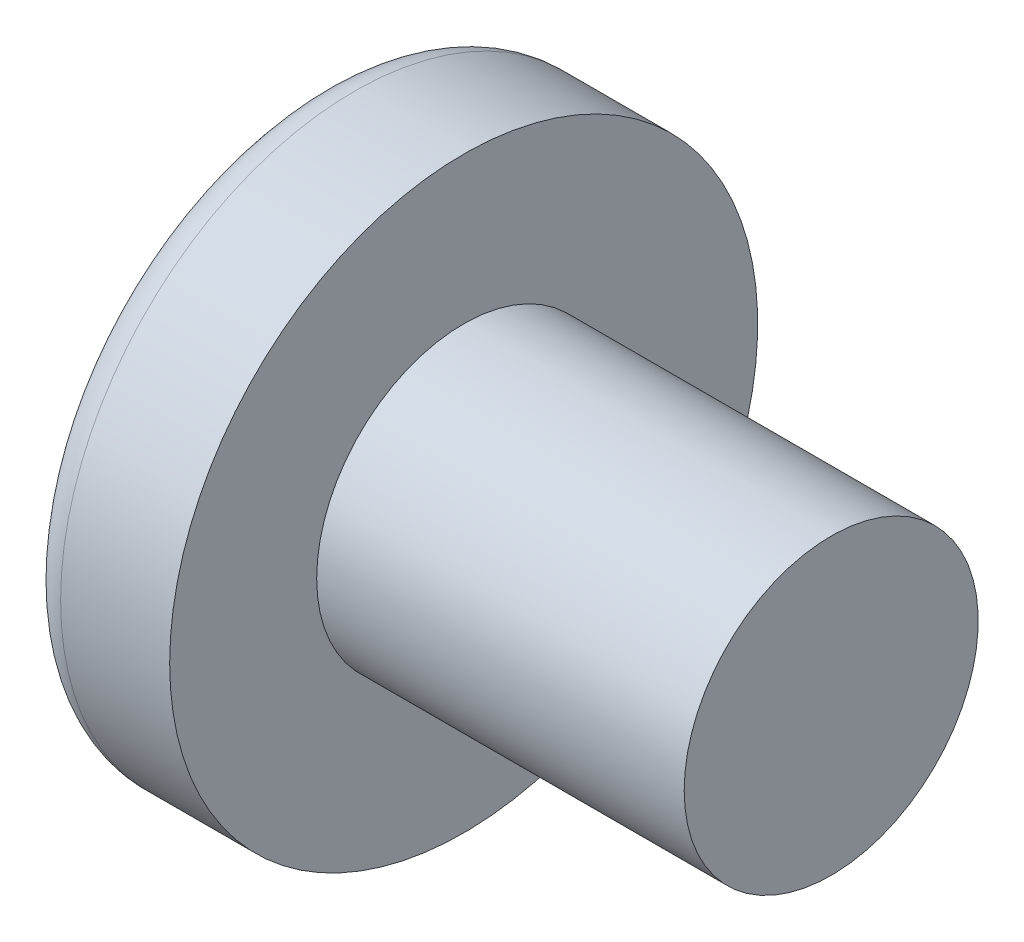
ISO-10303-21;
HEADER;
FILE_DESCRIPTION(('STEP AP214'),'2;1');
FILE_NAME('part.step','',(''),(''),'','','');
FILE_SCHEMA(('AUTOMOTIVE_DESIGN { 1 0 10303 214 1 1 1 1 }'));
ENDSEC;
DATA;
#1=APPLICATION_CONTEXT('core data for automotive mechanical design processes');
#2=APPLICATION_PROTOCOL_DEFINITION('international standard','automotive_design',2000,#1);
#3=PRODUCT_CONTEXT('',#1,'mechanical');
#4=PRODUCT('Part','Part','',(#3));
#5=PRODUCT_RELATED_PRODUCT_CATEGORY('part','',(#4));
#6=PRODUCT_DEFINITION_FORMATION('','',#4);
#7=PRODUCT_DEFINITION_CONTEXT('part definition',#1,'design');
#8=PRODUCT_DEFINITION('design','',#6,#7);
#9=PRODUCT_DEFINITION_SHAPE('','',#8);
#10=(LENGTH_UNIT() NAMED_UNIT(*) SI_UNIT(.MILLI.,.METRE.));
#11=(NAMED_UNIT(*) PLANE_ANGLE_UNIT() SI_UNIT($,.RADIAN.));
#12=(NAMED_UNIT(*) SI_UNIT($,.STERADIAN.) SOLID_ANGLE_UNIT());
#13=UNCERTAINTY_MEASURE_WITH_UNIT(LENGTH_MEASURE(1.E-05),#10,'distance_accuracy_value','');
#14=(GEOMETRIC_REPRESENTATION_CONTEXT(3) GLOBAL_UNCERTAINTY_ASSIGNED_CONTEXT((#13)) GLOBAL_UNIT_ASSIGNED_CONTEXT((#10,
#11,#12)) REPRESENTATION_CONTEXT('',''));
#15=CARTESIAN_POINT('',(0.,0.,0.));
#16=DIRECTION('',(0.,0.,1.));
#17=DIRECTION('',(1.,0.,0.));
#18=AXIS2_PLACEMENT_3D('',#15,#16,#17);
#19=CARTESIAN_POINT('',(6.5,0.,0.));
#20=DIRECTION('',(-1.,0.,0.));
#21=DIRECTION('',(0.,1.,0.));
#22=AXIS2_PLACEMENT_3D('',#19,#20,#21);
#23=SPHERICAL_SURFACE('',#22,6.5);
#24=CARTESIAN_POINT('',(1.22696010591455,0.,0.));
#25=DIRECTION('',(-1.,0.,0.));
#26=DIRECTION('',(0.,0.,1.));
#27=AXIS2_PLACEMENT_3D('',#24,#25,#26);
#28=CIRCLE('',#27,3.80066445182724);
#29=CARTESIAN_POINT('',(1.22696010591455,0.,3.80066445182724));
#30=VERTEX_POINT('',#29);
#31=EDGE_CURVE('E136',#30,#30,#28,.T.);
#32=ORIENTED_EDGE('',*,*,#31,.T.);
#33=EDGE_LOOP('',(#32));
#34=FACE_BOUND('',#33,.T.);
#35=CARTESIAN_POINT('',(6.48571960757402,-0.15048155459631,0.));
#36=DIRECTION('',(-0.0944735162161081,-0.995527375180494,0.));
#37=DIRECTION('',(0.995527375180494,-0.0944735162161081,0.));
#38=AXIS2_PLACEMENT_3D('',#35,#36,#37);
#39=CIRCLE('',#38,6.49824217555167);
#40=CARTESIAN_POINT('',(0.314004666074212,0.4352015980154,1.94783502836694));
#41=VERTEX_POINT('',#40);
#42=CARTESIAN_POINT('',(0.0329034112486444,0.461877533422321,0.461877533422322));
#43=VERTEX_POINT('',#42);
#44=EDGE_CURVE('E167',#41,#43,#39,.T.);
#45=ORIENTED_EDGE('',*,*,#44,.F.);
#46=CARTESIAN_POINT('',(5.02565375064329,0.,-1.83590765485334));
#47=DIRECTION('',(0.626149356629992,0.,0.779703137861998));
#48=DIRECTION('',(0.779703137861998,0.,-0.626149356629992));
#49=AXIS2_PLACEMENT_3D('',#46,#47,#48);
#50=CIRCLE('',#49,6.05852673674539);
#51=CARTESIAN_POINT('',(0.314004666074212,-0.435201598015413,1.94783502836693));
#52=VERTEX_POINT('',#51);
#53=EDGE_CURVE('E132',#41,#52,#50,.T.);
#54=ORIENTED_EDGE('',*,*,#53,.T.);
#55=CARTESIAN_POINT('',(6.48571960757402,0.15048155459631,0.));
#56=DIRECTION('',(-0.094473516216108,0.995527375180494,0.));
#57=DIRECTION('',(-0.995527375180494,-0.094473516216108,0.));
#58=AXIS2_PLACEMENT_3D('',#55,#56,#57);
#59=CIRCLE('',#58,6.49824217555167);
#60=CARTESIAN_POINT('',(0.0329034112486444,-0.461877533422324,0.461877533422322));
#61=VERTEX_POINT('',#60);
#62=EDGE_CURVE('E88',#61,#52,#59,.T.);
#63=ORIENTED_EDGE('',*,*,#62,.F.);
#64=CARTESIAN_POINT('',(6.48571960757402,0.,-0.15048155459631));
#65=DIRECTION('',(-0.094473516216108,0.,-0.995527375180494));
#66=DIRECTION('',(-0.995527375180494,0.,0.094473516216108));
#67=AXIS2_PLACEMENT_3D('',#64,#65,#66);
#68=CIRCLE('',#67,6.49824217555167);
#69=CARTESIAN_POINT('',(0.314004666074212,-1.94783502836693,0.435201598015406));
#70=VERTEX_POINT('',#69);
#71=EDGE_CURVE('E113',#70,#61,#68,.T.);
#72=ORIENTED_EDGE('',*,*,#71,.F.);
#73=CARTESIAN_POINT('',(5.02565375064329,1.83590765485334,0.));
#74=DIRECTION('',(0.626149356629992,-0.779703137861998,0.));
#75=DIRECTION('',(0.779703137861998,0.626149356629992,0.));
#76=AXIS2_PLACEMENT_3D('',#73,#74,#75);
#77=CIRCLE('',#76,6.05852673674539);
#78=CARTESIAN_POINT('',(0.314004666074212,-1.94783502836693,-0.435201598015406));
#79=VERTEX_POINT('',#78);
#80=EDGE_CURVE('E121',#70,#79,#77,.T.);
#81=ORIENTED_EDGE('',*,*,#80,.T.);
#82=CARTESIAN_POINT('',(6.48571960757402,0.,0.15048155459631));
#83=DIRECTION('',(-0.0944735162161081,0.,0.995527375180494));
#84=DIRECTION('',(0.995527375180494,0.,0.0944735162161081));
#85=AXIS2_PLACEMENT_3D('',#82,#83,#84);
#86=CIRCLE('',#85,6.49824217555167);
#87=CARTESIAN_POINT('',(0.0329034112486444,-0.461877533422321,-0.461877533422323));
#88=VERTEX_POINT('',#87);
#89=EDGE_CURVE('E31',#88,#79,#86,.T.);
#90=ORIENTED_EDGE('',*,*,#89,.F.);
#91=CARTESIAN_POINT('',(0.314004666074212,-0.435201598015399,-1.94783502836693));
#92=VERTEX_POINT('',#91);
#93=EDGE_CURVE('E174',#92,#88,#59,.T.);
#94=ORIENTED_EDGE('',*,*,#93,.F.);
#95=CARTESIAN_POINT('',(5.02565375064329,0.,1.83590765485334));
#96=DIRECTION('',(0.626149356629992,0.,-0.779703137861998));
#97=DIRECTION('',(-0.779703137861998,0.,-0.626149356629992));
#98=AXIS2_PLACEMENT_3D('',#95,#96,#97);
#99=CIRCLE('',#98,6.05852673674539);
#100=CARTESIAN_POINT('',(0.314004666074212,0.435201598015413,-1.94783502836693));
#101=VERTEX_POINT('',#100);
#102=EDGE_CURVE('E114',#92,#101,#99,.T.);
#103=ORIENTED_EDGE('',*,*,#102,.T.);
#104=CARTESIAN_POINT('',(0.0329034112486444,0.461877533422324,-0.461877533422323));
#105=VERTEX_POINT('',#104);
#106=EDGE_CURVE('E162',#105,#101,#39,.T.);
#107=ORIENTED_EDGE('',*,*,#106,.F.);
#108=CARTESIAN_POINT('',(0.314004666074212,1.94783502836693,-0.435201598015406));
#109=VERTEX_POINT('',#108);
#110=EDGE_CURVE('E24',#109,#105,#86,.T.);
#111=ORIENTED_EDGE('',*,*,#110,.F.);
#112=CARTESIAN_POINT('',(5.02565375064329,-1.83590765485334,0.));
#113=DIRECTION('',(0.626149356629992,0.779703137861998,0.));
#114=DIRECTION('',(-0.779703137861998,0.626149356629992,0.));
#115=AXIS2_PLACEMENT_3D('',#112,#113,#114);
#116=CIRCLE('',#115,6.05852673674539);
#117=CARTESIAN_POINT('',(0.314004666074212,1.94783502836693,0.435201598015406));
#118=VERTEX_POINT('',#117);
#119=EDGE_CURVE('E11',#109,#118,#116,.T.);
#120=ORIENTED_EDGE('',*,*,#119,.T.);
#121=EDGE_CURVE('E150',#43,#118,#68,.T.);
#122=ORIENTED_EDGE('',*,*,#121,.F.);
#123=EDGE_LOOP('',(#45,#54,#63,#72,#81,#90,#94,#103,#107,#111,#120,#122));
#124=FACE_BOUND('',#123,.T.);
#125=ADVANCED_FACE('F16',(#34,#124),#23,.T.);
#126=CARTESIAN_POINT('',(2.73951715374841,0.,-0.20502541296061));
#127=DIRECTION('',(-0.0944735162161081,0.,0.995527375180494));
#128=DIRECTION('',(0.995527375180494,0.,0.0944735162161081));
#129=AXIS2_PLACEMENT_3D('',#126,#127,#128);
#130=PLANE('',#129);
#131=ORIENTED_EDGE('',*,*,#110,.T.);
#132=DIRECTION('',(0.991114231601325,-0.0940547178968607,0.0940547178968604));
#133=VECTOR('',#132,1.);
#134=CARTESIAN_POINT('',(2.75862941145706,0.203211698708667,-0.203211698708667));
#135=LINE('',#134,#133);
#136=CARTESIAN_POINT('',(2.45,0.232500000000001,-0.232499999999999));
#137=VERTEX_POINT('',#136);
#138=EDGE_CURVE('E156',#105,#137,#135,.T.);
#139=ORIENTED_EDGE('',*,*,#138,.T.);
#140=DIRECTION('',(0.777577482844895,-0.624442325509115,0.0737905162291584));
#141=VECTOR('',#140,1.);
#142=CARTESIAN_POINT('',(0.,2.2,-0.465));
#143=LINE('',#142,#141);
#144=EDGE_CURVE('E137',#109,#137,#143,.T.);
#145=ORIENTED_EDGE('',*,*,#144,.F.);
#146=EDGE_LOOP('',(#131,#139,#145));
#147=FACE_BOUND('',#146,.T.);
#148=ADVANCED_FACE('F155',(#147),#130,.T.);
#149=DIRECTION('',(0.777577482844895,0.624442325509115,0.0737905162291584));
#150=VECTOR('',#149,1.);
#151=CARTESIAN_POINT('',(0.,-2.2,-0.465));
#152=LINE('',#151,#150);
#153=CARTESIAN_POINT('',(2.45,-0.2325,-0.2325));
#154=VERTEX_POINT('',#153);
#155=EDGE_CURVE('E122',#79,#154,#152,.T.);
#156=ORIENTED_EDGE('',*,*,#155,.T.);
#157=DIRECTION('',(-0.991114231601325,-0.0940547178968599,-0.0940547178968604));
#158=VECTOR('',#157,1.);
#159=CARTESIAN_POINT('',(2.75862941145706,-0.203211698708666,-0.203211698708667));
#160=LINE('',#159,#158);
#161=EDGE_CURVE('E177',#154,#88,#160,.T.);
#162=ORIENTED_EDGE('',*,*,#161,.T.);
#163=ORIENTED_EDGE('',*,*,#89,.T.);
#164=EDGE_LOOP('',(#156,#162,#163));
#165=FACE_BOUND('',#164,.T.);
#166=ADVANCED_FACE('F192',(#165),#130,.T.);
#167=CARTESIAN_POINT('',(2.73951715374841,0.,0.20502541296061));
#168=DIRECTION('',(-0.094473516216108,0.,-0.995527375180494));
#169=DIRECTION('',(-0.995527375180494,0.,0.094473516216108));
#170=AXIS2_PLACEMENT_3D('',#167,#168,#169);
#171=PLANE('',#170);
#172=DIRECTION('',(0.777577482844895,-0.624442325509115,-0.0737905162291584));
#173=VECTOR('',#172,1.);
#174=CARTESIAN_POINT('',(0.,2.2,0.465));
#175=LINE('',#174,#173);
#176=CARTESIAN_POINT('',(2.45,0.2325,0.2325));
#177=VERTEX_POINT('',#176);
#178=EDGE_CURVE('E193',#118,#177,#175,.T.);
#179=ORIENTED_EDGE('',*,*,#178,.T.);
#180=DIRECTION('',(-0.991114231601325,0.0940547178968601,0.0940547178968603));
#181=VECTOR('',#180,1.);
#182=CARTESIAN_POINT('',(2.75862941145706,0.203211698708666,0.203211698708667));
#183=LINE('',#182,#181);
#184=EDGE_CURVE('E171',#177,#43,#183,.T.);
#185=ORIENTED_EDGE('',*,*,#184,.T.);
#186=ORIENTED_EDGE('',*,*,#121,.T.);
#187=EDGE_LOOP('',(#179,#185,#186));
#188=FACE_BOUND('',#187,.T.);
#189=ADVANCED_FACE('F197',(#188),#171,.T.);
#190=ORIENTED_EDGE('',*,*,#71,.T.);
#191=DIRECTION('',(0.991114231601325,0.0940547178968606,-0.0940547178968603));
#192=VECTOR('',#191,1.);
#193=CARTESIAN_POINT('',(2.75862941145706,-0.203211698708668,0.203211698708667));
#194=LINE('',#193,#192);
#195=CARTESIAN_POINT('',(2.45,-0.232500000000001,0.232499999999999));
#196=VERTEX_POINT('',#195);
#197=EDGE_CURVE('E86',#61,#196,#194,.T.);
#198=ORIENTED_EDGE('',*,*,#197,.T.);
#199=DIRECTION('',(0.777577482844895,0.624442325509115,-0.0737905162291582));
#200=VECTOR('',#199,1.);
#201=CARTESIAN_POINT('',(0.,-2.2,0.464999999999999));
#202=LINE('',#201,#200);
#203=EDGE_CURVE('E111',#70,#196,#202,.T.);
#204=ORIENTED_EDGE('',*,*,#203,.F.);
#205=EDGE_LOOP('',(#190,#198,#204));
#206=FACE_BOUND('',#205,.T.);
#207=ADVANCED_FACE('F110',(#206),#171,.T.);
#208=CARTESIAN_POINT('',(-25.4,0.,0.));
#209=DIRECTION('',(-1.,0.,0.));
#210=DIRECTION('',(0.,0.,1.));
#211=AXIS2_PLACEMENT_3D('',#208,#209,#210);
#212=CYLINDRICAL_SURFACE('',#211,2.);
#213=CARTESIAN_POINT('',(8.1,0.,0.));
#214=DIRECTION('',(-1.,0.,0.));
#215=DIRECTION('',(0.,0.,1.));
#216=AXIS2_PLACEMENT_3D('',#213,#214,#215);
#217=CIRCLE('',#216,2.);
#218=CARTESIAN_POINT('',(8.1,0.,2.));
#219=VERTEX_POINT('',#218);
#220=EDGE_CURVE('E133',#219,#219,#217,.T.);
#221=ORIENTED_EDGE('',*,*,#220,.T.);
#222=EDGE_LOOP('',(#221));
#223=FACE_BOUND('',#222,.T.);
#224=CARTESIAN_POINT('',(3.1,0.,0.));
#225=DIRECTION('',(-1.,0.,0.));
#226=DIRECTION('',(0.,0.,1.));
#227=AXIS2_PLACEMENT_3D('',#224,#225,#226);
#228=CIRCLE('',#227,2.);
#229=CARTESIAN_POINT('',(3.1,0.,2.));
#230=VERTEX_POINT('',#229);
#231=EDGE_CURVE('E146',#230,#230,#228,.T.);
#232=ORIENTED_EDGE('',*,*,#231,.F.);
#233=EDGE_LOOP('',(#232));
#234=FACE_BOUND('',#233,.T.);
#235=ADVANCED_FACE('F18',(#223,#234),#212,.T.);
#236=CARTESIAN_POINT('',(3.1,2.,0.));
#237=DIRECTION('',(-1.,0.,0.));
#238=DIRECTION('',(0.,0.,1.));
#239=AXIS2_PLACEMENT_3D('',#236,#237,#238);
#240=PLANE('',#239);
#241=CARTESIAN_POINT('',(3.1,0.,0.));
#242=DIRECTION('',(-1.,0.,0.));
#243=DIRECTION('',(0.,0.,1.));
#244=AXIS2_PLACEMENT_3D('',#241,#242,#243);
#245=CIRCLE('',#244,4.);
#246=CARTESIAN_POINT('',(3.1,0.,4.));
#247=VERTEX_POINT('',#246);
#248=EDGE_CURVE('E143',#247,#247,#245,.T.);
#249=ORIENTED_EDGE('',*,*,#248,.F.);
#250=EDGE_LOOP('',(#249));
#251=FACE_BOUND('',#250,.T.);
#252=ORIENTED_EDGE('',*,*,#231,.T.);
#253=EDGE_LOOP('',(#252));
#254=FACE_BOUND('',#253,.T.);
#255=ADVANCED_FACE('F226',(#251,#254),#240,.F.);
#256=CARTESIAN_POINT('',(-25.4,0.,0.));
#257=DIRECTION('',(-1.,0.,0.));
#258=DIRECTION('',(0.,0.,1.));
#259=AXIS2_PLACEMENT_3D('',#256,#257,#258);
#260=CYLINDRICAL_SURFACE('',#259,4.);
#261=ORIENTED_EDGE('',*,*,#248,.T.);
#262=EDGE_LOOP('',(#261));
#263=FACE_BOUND('',#262,.T.);
#264=CARTESIAN_POINT('',(1.61635382117009,0.,0.));
#265=DIRECTION('',(-1.,0.,0.));
#266=DIRECTION('',(0.,0.,1.));
#267=AXIS2_PLACEMENT_3D('',#264,#265,#266);
#268=CIRCLE('',#267,4.);
#269=CARTESIAN_POINT('',(1.61635382117009,0.,4.));
#270=VERTEX_POINT('',#269);
#271=EDGE_CURVE('E140',#270,#270,#268,.T.);
#272=ORIENTED_EDGE('',*,*,#271,.F.);
#273=EDGE_LOOP('',(#272));
#274=FACE_BOUND('',#273,.T.);
#275=ADVANCED_FACE('F223',(#263,#274),#260,.T.);
#276=CARTESIAN_POINT('',(1.61635382117009,0.,0.));
#277=DIRECTION('',(-1.,0.,0.));
#278=DIRECTION('',(0.,0.,1.));
#279=AXIS2_PLACEMENT_3D('',#276,#277,#278);
#280=TOROIDAL_SURFACE('',#279,3.52,0.48);
#281=ORIENTED_EDGE('',*,*,#271,.T.);
#282=EDGE_LOOP('',(#281));
#283=FACE_BOUND('',#282,.T.);
#284=ORIENTED_EDGE('',*,*,#31,.F.);
#285=EDGE_LOOP('',(#284));
#286=FACE_BOUND('',#285,.T.);
#287=ADVANCED_FACE('F220',(#283,#286),#280,.T.);
#288=CARTESIAN_POINT('',(8.1,2.,0.));
#289=DIRECTION('',(1.,0.,0.));
#290=DIRECTION('',(0.,0.,-1.));
#291=AXIS2_PLACEMENT_3D('',#288,#289,#290);
#292=PLANE('',#291);
#293=ORIENTED_EDGE('',*,*,#220,.F.);
#294=EDGE_LOOP('',(#293));
#295=FACE_BOUND('',#294,.T.);
#296=ADVANCED_FACE('F218',(#295),#292,.T.);
#297=CARTESIAN_POINT('',(2.45,0.2325,0.2325));
#298=DIRECTION('',(0.626149356629992,0.779703137861998,0.));
#299=DIRECTION('',(-0.779703137861998,0.626149356629992,0.));
#300=AXIS2_PLACEMENT_3D('',#297,#298,#299);
#301=PLANE('',#300);
#302=ORIENTED_EDGE('',*,*,#144,.T.);
#303=DIRECTION('',(0.,0.,-1.));
#304=VECTOR('',#303,1.);
#305=CARTESIAN_POINT('',(2.45,0.2325,0.2325));
#306=LINE('',#305,#304);
#307=EDGE_CURVE('E104',#177,#137,#306,.T.);
#308=ORIENTED_EDGE('',*,*,#307,.F.);
#309=ORIENTED_EDGE('',*,*,#178,.F.);
#310=ORIENTED_EDGE('',*,*,#119,.F.);
#311=EDGE_LOOP('',(#302,#308,#309,#310));
#312=FACE_BOUND('',#311,.T.);
#313=ADVANCED_FACE('F196',(#312),#301,.F.);
#314=CARTESIAN_POINT('',(2.45,-0.2325,-0.2325));
#315=DIRECTION('',(0.626149356629992,-0.779703137861998,0.));
#316=DIRECTION('',(0.779703137861998,0.626149356629992,0.));
#317=AXIS2_PLACEMENT_3D('',#314,#315,#316);
#318=PLANE('',#317);
#319=ORIENTED_EDGE('',*,*,#203,.T.);
#320=DIRECTION('',(0.,0.,1.));
#321=VECTOR('',#320,1.);
#322=CARTESIAN_POINT('',(2.45,-0.2325,-0.2325));
#323=LINE('',#322,#321);
#324=EDGE_CURVE('E103',#154,#196,#323,.T.);
#325=ORIENTED_EDGE('',*,*,#324,.F.);
#326=ORIENTED_EDGE('',*,*,#155,.F.);
#327=ORIENTED_EDGE('',*,*,#80,.F.);
#328=EDGE_LOOP('',(#319,#325,#326,#327));
#329=FACE_BOUND('',#328,.T.);
#330=ADVANCED_FACE('F118',(#329),#318,.F.);
#331=CARTESIAN_POINT('',(2.45,0.2325,-0.2325));
#332=DIRECTION('',(-1.,0.,0.));
#333=DIRECTION('',(0.,0.,1.));
#334=AXIS2_PLACEMENT_3D('',#331,#332,#333);
#335=PLANE('',#334);
#336=DIRECTION('',(0.,1.,0.));
#337=VECTOR('',#336,1.);
#338=CARTESIAN_POINT('',(2.45,-0.2325,-0.2325));
#339=LINE('',#338,#337);
#340=EDGE_CURVE('E126',#154,#137,#339,.T.);
#341=ORIENTED_EDGE('',*,*,#340,.F.);
#342=ORIENTED_EDGE('',*,*,#324,.T.);
#343=DIRECTION('',(0.,-1.,0.));
#344=VECTOR('',#343,1.);
#345=CARTESIAN_POINT('',(2.45,0.2325,0.2325));
#346=LINE('',#345,#344);
#347=EDGE_CURVE('E95',#177,#196,#346,.T.);
#348=ORIENTED_EDGE('',*,*,#347,.F.);
#349=ORIENTED_EDGE('',*,*,#307,.T.);
#350=EDGE_LOOP('',(#341,#342,#348,#349));
#351=FACE_BOUND('',#350,.T.);
#352=ADVANCED_FACE('F124',(#351),#335,.T.);
#353=CARTESIAN_POINT('',(2.45,0.232500000000001,-0.232499999999999));
#354=DIRECTION('',(0.626149356629992,0.,-0.779703137861998));
#355=DIRECTION('',(0.779703137861998,0.,0.626149356629992));
#356=AXIS2_PLACEMENT_3D('',#353,#354,#355);
#357=PLANE('',#356);
#358=DIRECTION('',(0.777577482844895,0.0737905162291561,0.624442325509115));
#359=VECTOR('',#358,1.);
#360=CARTESIAN_POINT('',(0.,-0.464999999999992,-2.2));
#361=LINE('',#360,#359);
#362=EDGE_CURVE('E182',#92,#154,#361,.T.);
#363=ORIENTED_EDGE('',*,*,#362,.T.);
#364=ORIENTED_EDGE('',*,*,#340,.T.);
#365=DIRECTION('',(0.777577482844895,-0.0737905162291606,0.624442325509114));
#366=VECTOR('',#365,1.);
#367=CARTESIAN_POINT('',(0.,0.465000000000008,-2.2));
#368=LINE('',#367,#366);
#369=EDGE_CURVE('E92',#101,#137,#368,.T.);
#370=ORIENTED_EDGE('',*,*,#369,.F.);
#371=ORIENTED_EDGE('',*,*,#102,.F.);
#372=EDGE_LOOP('',(#363,#364,#370,#371));
#373=FACE_BOUND('',#372,.T.);
#374=ADVANCED_FACE('F187',(#373),#357,.F.);
#375=CARTESIAN_POINT('',(2.73951715374841,-0.20502541296061,0.));
#376=DIRECTION('',(-0.094473516216108,0.995527375180494,0.));
#377=DIRECTION('',(-0.995527375180494,-0.094473516216108,0.));
#378=AXIS2_PLACEMENT_3D('',#375,#376,#377);
#379=PLANE('',#378);
#380=ORIENTED_EDGE('',*,*,#93,.T.);
#381=ORIENTED_EDGE('',*,*,#161,.F.);
#382=ORIENTED_EDGE('',*,*,#362,.F.);
#383=EDGE_LOOP('',(#380,#381,#382));
#384=FACE_BOUND('',#383,.T.);
#385=ADVANCED_FACE('F191',(#384),#379,.T.);
#386=CARTESIAN_POINT('',(2.73951715374841,0.20502541296061,0.));
#387=DIRECTION('',(-0.0944735162161081,-0.995527375180494,0.));
#388=DIRECTION('',(0.995527375180494,-0.0944735162161081,0.));
#389=AXIS2_PLACEMENT_3D('',#386,#387,#388);
#390=PLANE('',#389);
#391=ORIENTED_EDGE('',*,*,#106,.T.);
#392=ORIENTED_EDGE('',*,*,#369,.T.);
#393=ORIENTED_EDGE('',*,*,#138,.F.);
#394=EDGE_LOOP('',(#391,#392,#393));
#395=FACE_BOUND('',#394,.T.);
#396=ADVANCED_FACE('F185',(#395),#390,.T.);
#397=CARTESIAN_POINT('',(2.45,-0.232500000000001,0.232499999999999));
#398=DIRECTION('',(0.626149356629992,0.,0.779703137861998));
#399=DIRECTION('',(-0.779703137861998,0.,0.626149356629992));
#400=AXIS2_PLACEMENT_3D('',#397,#398,#399);
#401=PLANE('',#400);
#402=DIRECTION('',(0.777577482844895,-0.0737905162291562,-0.624442325509115));
#403=VECTOR('',#402,1.);
#404=CARTESIAN_POINT('',(0.,0.464999999999992,2.2));
#405=LINE('',#404,#403);
#406=EDGE_CURVE('E91',#41,#177,#405,.T.);
#407=ORIENTED_EDGE('',*,*,#406,.T.);
#408=ORIENTED_EDGE('',*,*,#347,.T.);
#409=DIRECTION('',(0.777577482844895,0.0737905162291606,-0.624442325509114));
#410=VECTOR('',#409,1.);
#411=CARTESIAN_POINT('',(0.,-0.465000000000008,2.2));
#412=LINE('',#411,#410);
#413=EDGE_CURVE('E82',#52,#196,#412,.T.);
#414=ORIENTED_EDGE('',*,*,#413,.F.);
#415=ORIENTED_EDGE('',*,*,#53,.F.);
#416=EDGE_LOOP('',(#407,#408,#414,#415));
#417=FACE_BOUND('',#416,.T.);
#418=ADVANCED_FACE('F96',(#417),#401,.F.);
#419=ORIENTED_EDGE('',*,*,#44,.T.);
#420=ORIENTED_EDGE('',*,*,#184,.F.);
#421=ORIENTED_EDGE('',*,*,#406,.F.);
#422=EDGE_LOOP('',(#419,#420,#421));
#423=FACE_BOUND('',#422,.T.);
#424=ADVANCED_FACE('F198',(#423),#390,.T.);
#425=ORIENTED_EDGE('',*,*,#62,.T.);
#426=ORIENTED_EDGE('',*,*,#413,.T.);
#427=ORIENTED_EDGE('',*,*,#197,.F.);
#428=EDGE_LOOP('',(#425,#426,#427));
#429=FACE_BOUND('',#428,.T.);
#430=ADVANCED_FACE('F84',(#429),#379,.T.);
#431=CLOSED_SHELL('',(#125,#148,#166,#189,#207,#235,#255,#275,#287,#296,#313,#330,#352,#374,
#385,#396,#418,#424,#430));
#432=MANIFOLD_SOLID_BREP('B1',#431);
#433=ADVANCED_BREP_SHAPE_REPRESENTATION('',(#18,#432),#14);
#434=SHAPE_DEFINITION_REPRESENTATION(#9,#433);
ENDSEC;
END-ISO-10303-21;
